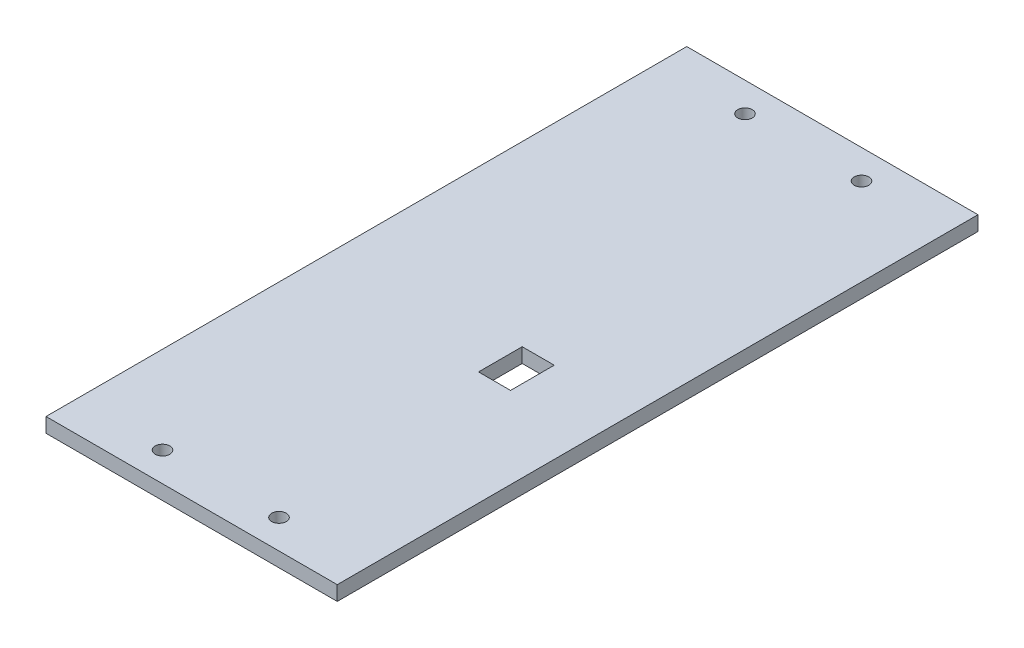
ISO-10303-21;
HEADER;
FILE_DESCRIPTION(('STEP AP214'),'2;1');
FILE_NAME('part.step','',(''),(''),'','','');
FILE_SCHEMA(('AUTOMOTIVE_DESIGN { 1 0 10303 214 1 1 1 1 }'));
ENDSEC;
DATA;
#1=APPLICATION_CONTEXT('core data for automotive mechanical design processes');
#2=APPLICATION_PROTOCOL_DEFINITION('international standard','automotive_design',2000,#1);
#3=PRODUCT_CONTEXT('',#1,'mechanical');
#4=PRODUCT('Part','Part','',(#3));
#5=PRODUCT_RELATED_PRODUCT_CATEGORY('part','',(#4));
#6=PRODUCT_DEFINITION_FORMATION('','',#4);
#7=PRODUCT_DEFINITION_CONTEXT('part definition',#1,'design');
#8=PRODUCT_DEFINITION('design','',#6,#7);
#9=PRODUCT_DEFINITION_SHAPE('','',#8);
#10=(LENGTH_UNIT() NAMED_UNIT(*) SI_UNIT(.MILLI.,.METRE.));
#11=(NAMED_UNIT(*) PLANE_ANGLE_UNIT() SI_UNIT($,.RADIAN.));
#12=(NAMED_UNIT(*) SI_UNIT($,.STERADIAN.) SOLID_ANGLE_UNIT());
#13=UNCERTAINTY_MEASURE_WITH_UNIT(LENGTH_MEASURE(1.E-05),#10,'distance_accuracy_value','');
#14=(GEOMETRIC_REPRESENTATION_CONTEXT(3) GLOBAL_UNCERTAINTY_ASSIGNED_CONTEXT((#13)) GLOBAL_UNIT_ASSIGNED_CONTEXT((#10,
#11,#12)) REPRESENTATION_CONTEXT('',''));
#15=CARTESIAN_POINT('',(0.,0.,0.));
#16=DIRECTION('',(0.,0.,1.));
#17=DIRECTION('',(1.,0.,0.));
#18=AXIS2_PLACEMENT_3D('',#15,#16,#17);
#19=CARTESIAN_POINT('',(50.,5.,-110.));
#20=DIRECTION('',(0.,1.,0.));
#21=DIRECTION('',(0.,0.,1.));
#22=AXIS2_PLACEMENT_3D('',#19,#20,#21);
#23=PLANE('',#22);
#24=DIRECTION('',(-1.,0.,0.));
#25=VECTOR('',#24,1.);
#26=CARTESIAN_POINT('',(11.,5.,7.50000000000003));
#27=LINE('',#26,#25);
#28=CARTESIAN_POINT('',(22.,5.,7.50000000000002));
#29=VERTEX_POINT('',#28);
#30=CARTESIAN_POINT('',(11.,5.,7.50000000000003));
#31=VERTEX_POINT('',#30);
#32=EDGE_CURVE('E114',#29,#31,#27,.T.);
#33=ORIENTED_EDGE('',*,*,#32,.F.);
#34=DIRECTION('',(0.,0.,-1.));
#35=VECTOR('',#34,1.);
#36=CARTESIAN_POINT('',(22.,5.,7.50000000000002));
#37=LINE('',#36,#35);
#38=CARTESIAN_POINT('',(22.,5.,22.5));
#39=VERTEX_POINT('',#38);
#40=EDGE_CURVE('E104',#39,#29,#37,.T.);
#41=ORIENTED_EDGE('',*,*,#40,.F.);
#42=DIRECTION('',(1.,0.,0.));
#43=VECTOR('',#42,1.);
#44=CARTESIAN_POINT('',(11.,5.,22.5));
#45=LINE('',#44,#43);
#46=CARTESIAN_POINT('',(11.,5.,22.5));
#47=VERTEX_POINT('',#46);
#48=EDGE_CURVE('E119',#47,#39,#45,.T.);
#49=ORIENTED_EDGE('',*,*,#48,.F.);
#50=DIRECTION('',(0.,0.,1.));
#51=VECTOR('',#50,1.);
#52=CARTESIAN_POINT('',(11.,5.,7.50000000000003));
#53=LINE('',#52,#51);
#54=EDGE_CURVE('E124',#31,#47,#53,.T.);
#55=ORIENTED_EDGE('',*,*,#54,.F.);
#56=EDGE_LOOP('',(#33,#41,#49,#55));
#57=FACE_BOUND('',#56,.T.);
#58=CARTESIAN_POINT('',(-20.,5.,100.));
#59=DIRECTION('',(0.,1.,0.));
#60=DIRECTION('',(0.,0.,1.));
#61=AXIS2_PLACEMENT_3D('',#58,#59,#60);
#62=CIRCLE('',#61,2.5);
#63=CARTESIAN_POINT('',(-20.,5.,102.5));
#64=VERTEX_POINT('',#63);
#65=EDGE_CURVE('E314',#64,#64,#62,.T.);
#66=ORIENTED_EDGE('',*,*,#65,.F.);
#67=EDGE_LOOP('',(#66));
#68=FACE_BOUND('',#67,.T.);
#69=CARTESIAN_POINT('',(20.,5.,-100.));
#70=DIRECTION('',(0.,1.,0.));
#71=DIRECTION('',(0.,0.,1.));
#72=AXIS2_PLACEMENT_3D('',#69,#70,#71);
#73=CIRCLE('',#72,2.5);
#74=CARTESIAN_POINT('',(20.,5.,-97.5));
#75=VERTEX_POINT('',#74);
#76=EDGE_CURVE('E308',#75,#75,#73,.T.);
#77=ORIENTED_EDGE('',*,*,#76,.F.);
#78=EDGE_LOOP('',(#77));
#79=FACE_BOUND('',#78,.T.);
#80=CARTESIAN_POINT('',(20.0000000000001,5.,100.));
#81=DIRECTION('',(0.,1.,0.));
#82=DIRECTION('',(0.,0.,1.));
#83=AXIS2_PLACEMENT_3D('',#80,#81,#82);
#84=CIRCLE('',#83,2.5);
#85=CARTESIAN_POINT('',(20.0000000000001,5.,102.5));
#86=VERTEX_POINT('',#85);
#87=EDGE_CURVE('E304',#86,#86,#84,.T.);
#88=ORIENTED_EDGE('',*,*,#87,.F.);
#89=EDGE_LOOP('',(#88));
#90=FACE_BOUND('',#89,.T.);
#91=CARTESIAN_POINT('',(-20.,5.,-100.));
#92=DIRECTION('',(0.,1.,0.));
#93=DIRECTION('',(0.,0.,1.));
#94=AXIS2_PLACEMENT_3D('',#91,#92,#93);
#95=CIRCLE('',#94,2.5);
#96=CARTESIAN_POINT('',(-20.,5.,-97.5));
#97=VERTEX_POINT('',#96);
#98=EDGE_CURVE('E323',#97,#97,#95,.T.);
#99=ORIENTED_EDGE('',*,*,#98,.F.);
#100=EDGE_LOOP('',(#99));
#101=FACE_BOUND('',#100,.T.);
#102=DIRECTION('',(0.,0.,-1.));
#103=VECTOR('',#102,1.);
#104=CARTESIAN_POINT('',(50.,5.,110.));
#105=LINE('',#104,#103);
#106=CARTESIAN_POINT('',(50.,5.,110.));
#107=VERTEX_POINT('',#106);
#108=CARTESIAN_POINT('',(50.,5.,-110.));
#109=VERTEX_POINT('',#108);
#110=EDGE_CURVE('E329',#107,#109,#105,.T.);
#111=ORIENTED_EDGE('',*,*,#110,.T.);
#112=DIRECTION('',(-1.,0.,0.));
#113=VECTOR('',#112,1.);
#114=CARTESIAN_POINT('',(-50.,5.,-110.));
#115=LINE('',#114,#113);
#116=CARTESIAN_POINT('',(-50.,5.,-110.));
#117=VERTEX_POINT('',#116);
#118=EDGE_CURVE('E333',#109,#117,#115,.T.);
#119=ORIENTED_EDGE('',*,*,#118,.T.);
#120=DIRECTION('',(0.,0.,1.));
#121=VECTOR('',#120,1.);
#122=CARTESIAN_POINT('',(-50.,5.,110.));
#123=LINE('',#122,#121);
#124=CARTESIAN_POINT('',(-50.,5.,110.));
#125=VERTEX_POINT('',#124);
#126=EDGE_CURVE('E335',#117,#125,#123,.T.);
#127=ORIENTED_EDGE('',*,*,#126,.T.);
#128=DIRECTION('',(1.,0.,0.));
#129=VECTOR('',#128,1.);
#130=CARTESIAN_POINT('',(-50.,5.,110.));
#131=LINE('',#130,#129);
#132=EDGE_CURVE('E337',#125,#107,#131,.T.);
#133=ORIENTED_EDGE('',*,*,#132,.T.);
#134=EDGE_LOOP('',(#111,#119,#127,#133));
#135=FACE_BOUND('',#134,.T.);
#136=ADVANCED_FACE('F40',(#57,#68,#79,#90,#101,#135),#23,.T.);
#137=CARTESIAN_POINT('',(50.,5.,110.));
#138=DIRECTION('',(-1.,0.,0.));
#139=DIRECTION('',(0.,0.,1.));
#140=AXIS2_PLACEMENT_3D('',#137,#138,#139);
#141=PLANE('',#140);
#142=DIRECTION('',(0.,0.,-1.));
#143=VECTOR('',#142,1.);
#144=CARTESIAN_POINT('',(50.,0.,110.));
#145=LINE('',#144,#143);
#146=CARTESIAN_POINT('',(50.,0.,110.));
#147=VERTEX_POINT('',#146);
#148=CARTESIAN_POINT('',(50.,0.,-110.));
#149=VERTEX_POINT('',#148);
#150=EDGE_CURVE('E326',#147,#149,#145,.T.);
#151=ORIENTED_EDGE('',*,*,#150,.T.);
#152=DIRECTION('',(0.,-1.,0.));
#153=VECTOR('',#152,1.);
#154=CARTESIAN_POINT('',(50.,5.,-110.));
#155=LINE('',#154,#153);
#156=EDGE_CURVE('E354',#109,#149,#155,.T.);
#157=ORIENTED_EDGE('',*,*,#156,.F.);
#158=ORIENTED_EDGE('',*,*,#110,.F.);
#159=DIRECTION('',(0.,-1.,0.));
#160=VECTOR('',#159,1.);
#161=CARTESIAN_POINT('',(50.,5.,110.));
#162=LINE('',#161,#160);
#163=EDGE_CURVE('E339',#107,#147,#162,.T.);
#164=ORIENTED_EDGE('',*,*,#163,.T.);
#165=EDGE_LOOP('',(#151,#157,#158,#164));
#166=FACE_BOUND('',#165,.T.);
#167=ADVANCED_FACE('F148',(#166),#141,.F.);
#168=CARTESIAN_POINT('',(-50.,5.,-110.));
#169=DIRECTION('',(0.,0.,1.));
#170=DIRECTION('',(1.,0.,0.));
#171=AXIS2_PLACEMENT_3D('',#168,#169,#170);
#172=PLANE('',#171);
#173=DIRECTION('',(-1.,0.,0.));
#174=VECTOR('',#173,1.);
#175=CARTESIAN_POINT('',(-50.,0.,-110.));
#176=LINE('',#175,#174);
#177=CARTESIAN_POINT('',(-50.,0.,-110.));
#178=VERTEX_POINT('',#177);
#179=EDGE_CURVE('E341',#149,#178,#176,.T.);
#180=ORIENTED_EDGE('',*,*,#179,.T.);
#181=DIRECTION('',(0.,-1.,0.));
#182=VECTOR('',#181,1.);
#183=CARTESIAN_POINT('',(-50.,5.,-110.));
#184=LINE('',#183,#182);
#185=EDGE_CURVE('E351',#117,#178,#184,.T.);
#186=ORIENTED_EDGE('',*,*,#185,.F.);
#187=ORIENTED_EDGE('',*,*,#118,.F.);
#188=ORIENTED_EDGE('',*,*,#156,.T.);
#189=EDGE_LOOP('',(#180,#186,#187,#188));
#190=FACE_BOUND('',#189,.T.);
#191=ADVANCED_FACE('F150',(#190),#172,.F.);
#192=CARTESIAN_POINT('',(-50.,5.,110.));
#193=DIRECTION('',(1.,0.,0.));
#194=DIRECTION('',(0.,0.,-1.));
#195=AXIS2_PLACEMENT_3D('',#192,#193,#194);
#196=PLANE('',#195);
#197=DIRECTION('',(0.,0.,1.));
#198=VECTOR('',#197,1.);
#199=CARTESIAN_POINT('',(-50.,0.,110.));
#200=LINE('',#199,#198);
#201=CARTESIAN_POINT('',(-50.,0.,110.));
#202=VERTEX_POINT('',#201);
#203=EDGE_CURVE('E343',#178,#202,#200,.T.);
#204=ORIENTED_EDGE('',*,*,#203,.T.);
#205=DIRECTION('',(0.,-1.,0.));
#206=VECTOR('',#205,1.);
#207=CARTESIAN_POINT('',(-50.,5.,110.));
#208=LINE('',#207,#206);
#209=EDGE_CURVE('E348',#125,#202,#208,.T.);
#210=ORIENTED_EDGE('',*,*,#209,.F.);
#211=ORIENTED_EDGE('',*,*,#126,.F.);
#212=ORIENTED_EDGE('',*,*,#185,.T.);
#213=EDGE_LOOP('',(#204,#210,#211,#212));
#214=FACE_BOUND('',#213,.T.);
#215=ADVANCED_FACE('F157',(#214),#196,.F.);
#216=CARTESIAN_POINT('',(-50.,5.,110.));
#217=DIRECTION('',(0.,0.,-1.));
#218=DIRECTION('',(-1.,0.,0.));
#219=AXIS2_PLACEMENT_3D('',#216,#217,#218);
#220=PLANE('',#219);
#221=DIRECTION('',(1.,0.,0.));
#222=VECTOR('',#221,1.);
#223=CARTESIAN_POINT('',(-50.,0.,110.));
#224=LINE('',#223,#222);
#225=EDGE_CURVE('E332',#202,#147,#224,.T.);
#226=ORIENTED_EDGE('',*,*,#225,.T.);
#227=ORIENTED_EDGE('',*,*,#163,.F.);
#228=ORIENTED_EDGE('',*,*,#132,.F.);
#229=ORIENTED_EDGE('',*,*,#209,.T.);
#230=EDGE_LOOP('',(#226,#227,#228,#229));
#231=FACE_BOUND('',#230,.T.);
#232=ADVANCED_FACE('F164',(#231),#220,.F.);
#233=CARTESIAN_POINT('',(0.,0.,0.));
#234=DIRECTION('',(0.,-1.,0.));
#235=DIRECTION('',(0.,0.,-1.));
#236=AXIS2_PLACEMENT_3D('',#233,#234,#235);
#237=PLANE('',#236);
#238=DIRECTION('',(0.,0.,-1.));
#239=VECTOR('',#238,1.);
#240=CARTESIAN_POINT('',(22.,0.,7.50000000000002));
#241=LINE('',#240,#239);
#242=CARTESIAN_POINT('',(22.,0.,22.5));
#243=VERTEX_POINT('',#242);
#244=CARTESIAN_POINT('',(22.,0.,7.50000000000002));
#245=VERTEX_POINT('',#244);
#246=EDGE_CURVE('E113',#243,#245,#241,.T.);
#247=ORIENTED_EDGE('',*,*,#246,.T.);
#248=DIRECTION('',(-1.,0.,0.));
#249=VECTOR('',#248,1.);
#250=CARTESIAN_POINT('',(11.,0.,7.50000000000003));
#251=LINE('',#250,#249);
#252=CARTESIAN_POINT('',(11.,0.,7.50000000000003));
#253=VERTEX_POINT('',#252);
#254=EDGE_CURVE('E54',#245,#253,#251,.T.);
#255=ORIENTED_EDGE('',*,*,#254,.T.);
#256=DIRECTION('',(0.,0.,1.));
#257=VECTOR('',#256,1.);
#258=CARTESIAN_POINT('',(11.,0.,7.50000000000003));
#259=LINE('',#258,#257);
#260=CARTESIAN_POINT('',(11.,0.,22.5));
#261=VERTEX_POINT('',#260);
#262=EDGE_CURVE('E11',#253,#261,#259,.T.);
#263=ORIENTED_EDGE('',*,*,#262,.T.);
#264=DIRECTION('',(1.,0.,0.));
#265=VECTOR('',#264,1.);
#266=CARTESIAN_POINT('',(11.,0.,22.5));
#267=LINE('',#266,#265);
#268=EDGE_CURVE('E47',#261,#243,#267,.T.);
#269=ORIENTED_EDGE('',*,*,#268,.T.);
#270=EDGE_LOOP('',(#247,#255,#263,#269));
#271=FACE_BOUND('',#270,.T.);
#272=CARTESIAN_POINT('',(-20.,0.,100.));
#273=DIRECTION('',(0.,-1.,0.));
#274=DIRECTION('',(0.,0.,-1.));
#275=AXIS2_PLACEMENT_3D('',#272,#273,#274);
#276=CIRCLE('',#275,2.5);
#277=CARTESIAN_POINT('',(-20.,0.,97.5));
#278=VERTEX_POINT('',#277);
#279=EDGE_CURVE('E311',#278,#278,#276,.F.);
#280=ORIENTED_EDGE('',*,*,#279,.T.);
#281=EDGE_LOOP('',(#280));
#282=FACE_BOUND('',#281,.T.);
#283=CARTESIAN_POINT('',(20.,0.,-100.));
#284=DIRECTION('',(0.,-1.,0.));
#285=DIRECTION('',(0.,0.,-1.));
#286=AXIS2_PLACEMENT_3D('',#283,#284,#285);
#287=CIRCLE('',#286,2.5);
#288=CARTESIAN_POINT('',(20.,0.,-102.5));
#289=VERTEX_POINT('',#288);
#290=EDGE_CURVE('E318',#289,#289,#287,.F.);
#291=ORIENTED_EDGE('',*,*,#290,.T.);
#292=EDGE_LOOP('',(#291));
#293=FACE_BOUND('',#292,.T.);
#294=CARTESIAN_POINT('',(20.0000000000001,0.,100.));
#295=DIRECTION('',(0.,-1.,0.));
#296=DIRECTION('',(0.,0.,-1.));
#297=AXIS2_PLACEMENT_3D('',#294,#295,#296);
#298=CIRCLE('',#297,2.5);
#299=CARTESIAN_POINT('',(20.0000000000001,0.,97.5));
#300=VERTEX_POINT('',#299);
#301=EDGE_CURVE('E301',#300,#300,#298,.F.);
#302=ORIENTED_EDGE('',*,*,#301,.T.);
#303=EDGE_LOOP('',(#302));
#304=FACE_BOUND('',#303,.T.);
#305=CARTESIAN_POINT('',(-20.,0.,-100.));
#306=DIRECTION('',(0.,-1.,0.));
#307=DIRECTION('',(0.,0.,-1.));
#308=AXIS2_PLACEMENT_3D('',#305,#306,#307);
#309=CIRCLE('',#308,2.5);
#310=CARTESIAN_POINT('',(-20.,0.,-102.5));
#311=VERTEX_POINT('',#310);
#312=EDGE_CURVE('E315',#311,#311,#309,.F.);
#313=ORIENTED_EDGE('',*,*,#312,.T.);
#314=EDGE_LOOP('',(#313));
#315=FACE_BOUND('',#314,.T.);
#316=ORIENTED_EDGE('',*,*,#150,.F.);
#317=ORIENTED_EDGE('',*,*,#225,.F.);
#318=ORIENTED_EDGE('',*,*,#203,.F.);
#319=ORIENTED_EDGE('',*,*,#179,.F.);
#320=EDGE_LOOP('',(#316,#317,#318,#319));
#321=FACE_BOUND('',#320,.T.);
#322=ADVANCED_FACE('F130',(#271,#282,#293,#304,#315,#321),#237,.T.);
#323=CARTESIAN_POINT('',(-20.,-0.00100000000000013,-100.));
#324=DIRECTION('',(0.,1.,0.));
#325=DIRECTION('',(0.,0.,1.));
#326=AXIS2_PLACEMENT_3D('',#323,#324,#325);
#327=CYLINDRICAL_SURFACE('',#326,2.5);
#328=ORIENTED_EDGE('',*,*,#312,.F.);
#329=EDGE_LOOP('',(#328));
#330=FACE_BOUND('',#329,.T.);
#331=ORIENTED_EDGE('',*,*,#98,.T.);
#332=EDGE_LOOP('',(#331));
#333=FACE_BOUND('',#332,.T.);
#334=ADVANCED_FACE('F171',(#330,#333),#327,.F.);
#335=CARTESIAN_POINT('',(20.0000000000001,-0.00100000000000013,100.));
#336=DIRECTION('',(0.,1.,0.));
#337=DIRECTION('',(0.,0.,1.));
#338=AXIS2_PLACEMENT_3D('',#335,#336,#337);
#339=CYLINDRICAL_SURFACE('',#338,2.5);
#340=ORIENTED_EDGE('',*,*,#301,.F.);
#341=EDGE_LOOP('',(#340));
#342=FACE_BOUND('',#341,.T.);
#343=ORIENTED_EDGE('',*,*,#87,.T.);
#344=EDGE_LOOP('',(#343));
#345=FACE_BOUND('',#344,.T.);
#346=ADVANCED_FACE('F174',(#342,#345),#339,.F.);
#347=CARTESIAN_POINT('',(20.,-0.00100000000000013,-100.));
#348=DIRECTION('',(0.,1.,0.));
#349=DIRECTION('',(0.,0.,1.));
#350=AXIS2_PLACEMENT_3D('',#347,#348,#349);
#351=CYLINDRICAL_SURFACE('',#350,2.5);
#352=ORIENTED_EDGE('',*,*,#290,.F.);
#353=EDGE_LOOP('',(#352));
#354=FACE_BOUND('',#353,.T.);
#355=ORIENTED_EDGE('',*,*,#76,.T.);
#356=EDGE_LOOP('',(#355));
#357=FACE_BOUND('',#356,.T.);
#358=ADVANCED_FACE('F176',(#354,#357),#351,.F.);
#359=CARTESIAN_POINT('',(-20.,-0.00100000000000013,100.));
#360=DIRECTION('',(0.,1.,0.));
#361=DIRECTION('',(0.,0.,1.));
#362=AXIS2_PLACEMENT_3D('',#359,#360,#361);
#363=CYLINDRICAL_SURFACE('',#362,2.5);
#364=ORIENTED_EDGE('',*,*,#279,.F.);
#365=EDGE_LOOP('',(#364));
#366=FACE_BOUND('',#365,.T.);
#367=ORIENTED_EDGE('',*,*,#65,.T.);
#368=EDGE_LOOP('',(#367));
#369=FACE_BOUND('',#368,.T.);
#370=ADVANCED_FACE('F146',(#366,#369),#363,.F.);
#371=CARTESIAN_POINT('',(22.,-0.00100000000000013,7.50000000000002));
#372=DIRECTION('',(1.,0.,0.));
#373=DIRECTION('',(0.,0.,-1.));
#374=AXIS2_PLACEMENT_3D('',#371,#372,#373);
#375=PLANE('',#374);
#376=DIRECTION('',(0.,1.,0.));
#377=VECTOR('',#376,1.);
#378=CARTESIAN_POINT('',(22.,-0.00100000000000013,22.5));
#379=LINE('',#378,#377);
#380=EDGE_CURVE('E108',#243,#39,#379,.T.);
#381=ORIENTED_EDGE('',*,*,#380,.T.);
#382=ORIENTED_EDGE('',*,*,#40,.T.);
#383=DIRECTION('',(0.,1.,0.));
#384=VECTOR('',#383,1.);
#385=CARTESIAN_POINT('',(22.,-0.00100000000000013,7.50000000000002));
#386=LINE('',#385,#384);
#387=EDGE_CURVE('E106',#245,#29,#386,.T.);
#388=ORIENTED_EDGE('',*,*,#387,.F.);
#389=ORIENTED_EDGE('',*,*,#246,.F.);
#390=EDGE_LOOP('',(#381,#382,#388,#389));
#391=FACE_BOUND('',#390,.T.);
#392=ADVANCED_FACE('F105',(#391),#375,.F.);
#393=CARTESIAN_POINT('',(11.,-0.00100000000000013,22.5));
#394=DIRECTION('',(0.,0.,1.));
#395=DIRECTION('',(1.,0.,0.));
#396=AXIS2_PLACEMENT_3D('',#393,#394,#395);
#397=PLANE('',#396);
#398=DIRECTION('',(0.,1.,0.));
#399=VECTOR('',#398,1.);
#400=CARTESIAN_POINT('',(11.,-0.00100000000000013,22.5));
#401=LINE('',#400,#399);
#402=EDGE_CURVE('E135',#261,#47,#401,.T.);
#403=ORIENTED_EDGE('',*,*,#402,.T.);
#404=ORIENTED_EDGE('',*,*,#48,.T.);
#405=ORIENTED_EDGE('',*,*,#380,.F.);
#406=ORIENTED_EDGE('',*,*,#268,.F.);
#407=EDGE_LOOP('',(#403,#404,#405,#406));
#408=FACE_BOUND('',#407,.T.);
#409=ADVANCED_FACE('F139',(#408),#397,.F.);
#410=CARTESIAN_POINT('',(11.,-0.00100000000000013,7.50000000000003));
#411=DIRECTION('',(-1.,0.,0.));
#412=DIRECTION('',(0.,0.,1.));
#413=AXIS2_PLACEMENT_3D('',#410,#411,#412);
#414=PLANE('',#413);
#415=DIRECTION('',(0.,1.,0.));
#416=VECTOR('',#415,1.);
#417=CARTESIAN_POINT('',(11.,-0.00100000000000013,7.50000000000003));
#418=LINE('',#417,#416);
#419=EDGE_CURVE('E120',#253,#31,#418,.T.);
#420=ORIENTED_EDGE('',*,*,#419,.T.);
#421=ORIENTED_EDGE('',*,*,#54,.T.);
#422=ORIENTED_EDGE('',*,*,#402,.F.);
#423=ORIENTED_EDGE('',*,*,#262,.F.);
#424=EDGE_LOOP('',(#420,#421,#422,#423));
#425=FACE_BOUND('',#424,.T.);
#426=ADVANCED_FACE('F134',(#425),#414,.F.);
#427=CARTESIAN_POINT('',(11.,-0.00100000000000013,7.50000000000003));
#428=DIRECTION('',(0.,0.,-1.));
#429=DIRECTION('',(-1.,0.,0.));
#430=AXIS2_PLACEMENT_3D('',#427,#428,#429);
#431=PLANE('',#430);
#432=ORIENTED_EDGE('',*,*,#387,.T.);
#433=ORIENTED_EDGE('',*,*,#32,.T.);
#434=ORIENTED_EDGE('',*,*,#419,.F.);
#435=ORIENTED_EDGE('',*,*,#254,.F.);
#436=EDGE_LOOP('',(#432,#433,#434,#435));
#437=FACE_BOUND('',#436,.T.);
#438=ADVANCED_FACE('F117',(#437),#431,.F.);
#439=CLOSED_SHELL('',(#136,#167,#191,#215,#232,#322,#334,#346,#358,#370,#392,#409,#426,#438));
#440=MANIFOLD_SOLID_BREP('B2',#439);
#441=ADVANCED_BREP_SHAPE_REPRESENTATION('',(#18,#440),#14);
#442=SHAPE_DEFINITION_REPRESENTATION(#9,#441);
ENDSEC;
END-ISO-10303-21;
